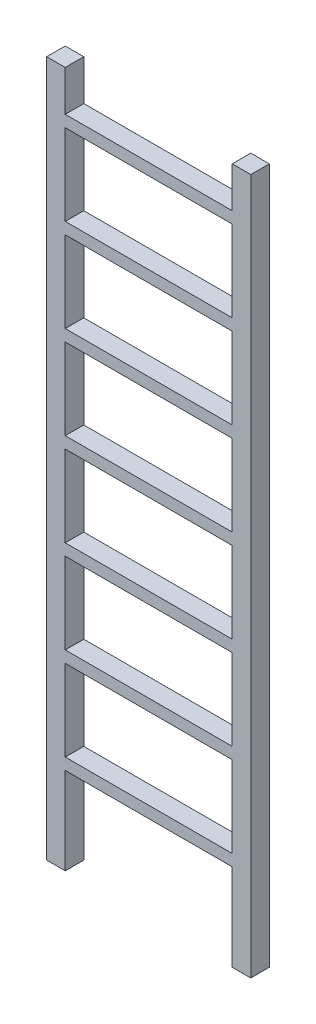
ISO-10303-21;
HEADER;
FILE_DESCRIPTION(('STEP AP214'),'2;1');
FILE_NAME('part.step','',(''),(''),'','','');
FILE_SCHEMA(('AUTOMOTIVE_DESIGN { 1 0 10303 214 1 1 1 1 }'));
ENDSEC;
DATA;
#1=APPLICATION_CONTEXT('core data for automotive mechanical design processes');
#2=APPLICATION_PROTOCOL_DEFINITION('international standard','automotive_design',2000,#1);
#3=PRODUCT_CONTEXT('',#1,'mechanical');
#4=PRODUCT('Part','Part','',(#3));
#5=PRODUCT_RELATED_PRODUCT_CATEGORY('part','',(#4));
#6=PRODUCT_DEFINITION_FORMATION('','',#4);
#7=PRODUCT_DEFINITION_CONTEXT('part definition',#1,'design');
#8=PRODUCT_DEFINITION('design','',#6,#7);
#9=PRODUCT_DEFINITION_SHAPE('','',#8);
#10=(LENGTH_UNIT() NAMED_UNIT(*) SI_UNIT(.MILLI.,.METRE.));
#11=(NAMED_UNIT(*) PLANE_ANGLE_UNIT() SI_UNIT($,.RADIAN.));
#12=(NAMED_UNIT(*) SI_UNIT($,.STERADIAN.) SOLID_ANGLE_UNIT());
#13=UNCERTAINTY_MEASURE_WITH_UNIT(LENGTH_MEASURE(1.E-05),#10,'distance_accuracy_value','');
#14=(GEOMETRIC_REPRESENTATION_CONTEXT(3) GLOBAL_UNCERTAINTY_ASSIGNED_CONTEXT((#13)) GLOBAL_UNIT_ASSIGNED_CONTEXT((#10,
#11,#12)) REPRESENTATION_CONTEXT('',''));
#15=CARTESIAN_POINT('',(0.,0.,0.));
#16=DIRECTION('',(0.,0.,1.));
#17=DIRECTION('',(1.,0.,0.));
#18=AXIS2_PLACEMENT_3D('',#15,#16,#17);
#19=CARTESIAN_POINT('',(-360.,-1500.,80.));
#20=DIRECTION('',(-1.,0.,0.));
#21=DIRECTION('',(0.,0.,1.));
#22=AXIS2_PLACEMENT_3D('',#19,#20,#21);
#23=PLANE('',#22);
#24=DIRECTION('',(0.,0.,1.));
#25=VECTOR('',#24,1.);
#26=CARTESIAN_POINT('',(-360.,-1075.,80.));
#27=LINE('',#26,#25);
#28=CARTESIAN_POINT('',(-360.,-1075.,0.));
#29=VERTEX_POINT('',#28);
#30=CARTESIAN_POINT('',(-360.,-1075.,80.));
#31=VERTEX_POINT('',#30);
#32=EDGE_CURVE('E309',#29,#31,#27,.T.);
#33=ORIENTED_EDGE('',*,*,#32,.F.);
#34=DIRECTION('',(0.,1.,0.));
#35=VECTOR('',#34,1.);
#36=CARTESIAN_POINT('',(-360.,-1500.,0.));
#37=LINE('',#36,#35);
#38=CARTESIAN_POINT('',(-360.,-725.,0.));
#39=VERTEX_POINT('',#38);
#40=EDGE_CURVE('E489',#29,#39,#37,.T.);
#41=ORIENTED_EDGE('',*,*,#40,.T.);
#42=DIRECTION('',(0.,0.,-1.));
#43=VECTOR('',#42,1.);
#44=CARTESIAN_POINT('',(-360.,-725.,80.));
#45=LINE('',#44,#43);
#46=CARTESIAN_POINT('',(-360.,-725.,80.));
#47=VERTEX_POINT('',#46);
#48=EDGE_CURVE('E327',#47,#39,#45,.T.);
#49=ORIENTED_EDGE('',*,*,#48,.F.);
#50=DIRECTION('',(0.,1.,0.));
#51=VECTOR('',#50,1.);
#52=CARTESIAN_POINT('',(-360.,-1500.,80.));
#53=LINE('',#52,#51);
#54=EDGE_CURVE('E478',#31,#47,#53,.T.);
#55=ORIENTED_EDGE('',*,*,#54,.F.);
#56=EDGE_LOOP('',(#33,#41,#49,#55));
#57=FACE_BOUND('',#56,.T.);
#58=ADVANCED_FACE('F41',(#57),#23,.F.);
#59=DIRECTION('',(0.,0.,-1.));
#60=VECTOR('',#59,1.);
#61=CARTESIAN_POINT('',(-360.,-1125.,80.));
#62=LINE('',#61,#60);
#63=CARTESIAN_POINT('',(-360.,-1125.,80.));
#64=VERTEX_POINT('',#63);
#65=CARTESIAN_POINT('',(-360.,-1125.,0.));
#66=VERTEX_POINT('',#65);
#67=EDGE_CURVE('E293',#64,#66,#62,.T.);
#68=ORIENTED_EDGE('',*,*,#67,.F.);
#69=CARTESIAN_POINT('',(-360.,-1500.,80.));
#70=VERTEX_POINT('',#69);
#71=EDGE_CURVE('E474',#70,#64,#53,.T.);
#72=ORIENTED_EDGE('',*,*,#71,.F.);
#73=DIRECTION('',(0.,0.,-1.));
#74=VECTOR('',#73,1.);
#75=CARTESIAN_POINT('',(-360.,-1500.,80.));
#76=LINE('',#75,#74);
#77=CARTESIAN_POINT('',(-360.,-1500.,0.));
#78=VERTEX_POINT('',#77);
#79=EDGE_CURVE('E485',#70,#78,#76,.T.);
#80=ORIENTED_EDGE('',*,*,#79,.T.);
#81=EDGE_CURVE('E486',#78,#66,#37,.T.);
#82=ORIENTED_EDGE('',*,*,#81,.T.);
#83=EDGE_LOOP('',(#68,#72,#80,#82));
#84=FACE_BOUND('',#83,.T.);
#85=ADVANCED_FACE('F664',(#84),#23,.F.);
#86=CARTESIAN_POINT('',(360.,-1500.,80.));
#87=DIRECTION('',(1.,0.,0.));
#88=DIRECTION('',(0.,0.,-1.));
#89=AXIS2_PLACEMENT_3D('',#86,#87,#88);
#90=PLANE('',#89);
#91=DIRECTION('',(0.,0.,-1.));
#92=VECTOR('',#91,1.);
#93=CARTESIAN_POINT('',(360.,-1075.,80.));
#94=LINE('',#93,#92);
#95=CARTESIAN_POINT('',(360.,-1075.,80.));
#96=VERTEX_POINT('',#95);
#97=CARTESIAN_POINT('',(360.,-1075.,0.));
#98=VERTEX_POINT('',#97);
#99=EDGE_CURVE('E64',#96,#98,#94,.T.);
#100=ORIENTED_EDGE('',*,*,#99,.F.);
#101=DIRECTION('',(0.,-1.,0.));
#102=VECTOR('',#101,1.);
#103=CARTESIAN_POINT('',(360.,-1500.,80.));
#104=LINE('',#103,#102);
#105=CARTESIAN_POINT('',(360.,-725.,80.));
#106=VERTEX_POINT('',#105);
#107=EDGE_CURVE('E556',#106,#96,#104,.T.);
#108=ORIENTED_EDGE('',*,*,#107,.F.);
#109=DIRECTION('',(0.,0.,1.));
#110=VECTOR('',#109,1.);
#111=CARTESIAN_POINT('',(360.,-725.,80.));
#112=LINE('',#111,#110);
#113=CARTESIAN_POINT('',(360.,-725.,0.));
#114=VERTEX_POINT('',#113);
#115=EDGE_CURVE('E320',#114,#106,#112,.T.);
#116=ORIENTED_EDGE('',*,*,#115,.F.);
#117=DIRECTION('',(0.,-1.,0.));
#118=VECTOR('',#117,1.);
#119=CARTESIAN_POINT('',(360.,-1500.,0.));
#120=LINE('',#119,#118);
#121=EDGE_CURVE('E284',#114,#98,#120,.T.);
#122=ORIENTED_EDGE('',*,*,#121,.T.);
#123=EDGE_LOOP('',(#100,#108,#116,#122));
#124=FACE_BOUND('',#123,.T.);
#125=ADVANCED_FACE('F543',(#124),#90,.F.);
#126=DIRECTION('',(0.,0.,1.));
#127=VECTOR('',#126,1.);
#128=CARTESIAN_POINT('',(360.,-1125.,80.));
#129=LINE('',#128,#127);
#130=CARTESIAN_POINT('',(360.,-1125.,0.));
#131=VERTEX_POINT('',#130);
#132=CARTESIAN_POINT('',(360.,-1125.,80.));
#133=VERTEX_POINT('',#132);
#134=EDGE_CURVE('E288',#131,#133,#129,.T.);
#135=ORIENTED_EDGE('',*,*,#134,.F.);
#136=CARTESIAN_POINT('',(360.,-1500.,0.));
#137=VERTEX_POINT('',#136);
#138=EDGE_CURVE('E275',#131,#137,#120,.T.);
#139=ORIENTED_EDGE('',*,*,#138,.T.);
#140=DIRECTION('',(0.,0.,-1.));
#141=VECTOR('',#140,1.);
#142=CARTESIAN_POINT('',(360.,-1500.,80.));
#143=LINE('',#142,#141);
#144=CARTESIAN_POINT('',(360.,-1500.,80.));
#145=VERTEX_POINT('',#144);
#146=EDGE_CURVE('E447',#145,#137,#143,.T.);
#147=ORIENTED_EDGE('',*,*,#146,.F.);
#148=EDGE_CURVE('E56',#133,#145,#104,.T.);
#149=ORIENTED_EDGE('',*,*,#148,.F.);
#150=EDGE_LOOP('',(#135,#139,#147,#149));
#151=FACE_BOUND('',#150,.T.);
#152=ADVANCED_FACE('F289',(#151),#90,.F.);
#153=DIRECTION('',(0.,0.,1.));
#154=VECTOR('',#153,1.);
#155=CARTESIAN_POINT('',(-360.,-675.,80.));
#156=LINE('',#155,#154);
#157=CARTESIAN_POINT('',(-360.,-675.,0.));
#158=VERTEX_POINT('',#157);
#159=CARTESIAN_POINT('',(-360.,-675.,80.));
#160=VERTEX_POINT('',#159);
#161=EDGE_CURVE('E333',#158,#160,#156,.T.);
#162=ORIENTED_EDGE('',*,*,#161,.F.);
#163=CARTESIAN_POINT('',(-360.,-325.,0.));
#164=VERTEX_POINT('',#163);
#165=EDGE_CURVE('E553',#158,#164,#37,.T.);
#166=ORIENTED_EDGE('',*,*,#165,.T.);
#167=DIRECTION('',(0.,0.,-1.));
#168=VECTOR('',#167,1.);
#169=CARTESIAN_POINT('',(-360.,-325.,80.));
#170=LINE('',#169,#168);
#171=CARTESIAN_POINT('',(-360.,-325.,80.));
#172=VERTEX_POINT('',#171);
#173=EDGE_CURVE('E351',#172,#164,#170,.T.);
#174=ORIENTED_EDGE('',*,*,#173,.F.);
#175=EDGE_CURVE('E623',#160,#172,#53,.T.);
#176=ORIENTED_EDGE('',*,*,#175,.F.);
#177=EDGE_LOOP('',(#162,#166,#174,#176));
#178=FACE_BOUND('',#177,.T.);
#179=ADVANCED_FACE('F641',(#178),#23,.F.);
#180=DIRECTION('',(0.,0.,-1.));
#181=VECTOR('',#180,1.);
#182=CARTESIAN_POINT('',(360.,-675.,80.));
#183=LINE('',#182,#181);
#184=CARTESIAN_POINT('',(360.,-675.,80.));
#185=VERTEX_POINT('',#184);
#186=CARTESIAN_POINT('',(360.,-675.,0.));
#187=VERTEX_POINT('',#186);
#188=EDGE_CURVE('E330',#185,#187,#183,.T.);
#189=ORIENTED_EDGE('',*,*,#188,.F.);
#190=CARTESIAN_POINT('',(360.,-325.,80.));
#191=VERTEX_POINT('',#190);
#192=EDGE_CURVE('E558',#191,#185,#104,.T.);
#193=ORIENTED_EDGE('',*,*,#192,.F.);
#194=DIRECTION('',(0.,0.,1.));
#195=VECTOR('',#194,1.);
#196=CARTESIAN_POINT('',(360.,-325.,80.));
#197=LINE('',#196,#195);
#198=CARTESIAN_POINT('',(360.,-325.,0.));
#199=VERTEX_POINT('',#198);
#200=EDGE_CURVE('E344',#199,#191,#197,.T.);
#201=ORIENTED_EDGE('',*,*,#200,.F.);
#202=EDGE_CURVE('E537',#199,#187,#120,.T.);
#203=ORIENTED_EDGE('',*,*,#202,.T.);
#204=EDGE_LOOP('',(#189,#193,#201,#203));
#205=FACE_BOUND('',#204,.T.);
#206=ADVANCED_FACE('F648',(#205),#90,.F.);
#207=DIRECTION('',(0.,0.,1.));
#208=VECTOR('',#207,1.);
#209=CARTESIAN_POINT('',(-360.,-275.,80.));
#210=LINE('',#209,#208);
#211=CARTESIAN_POINT('',(-360.,-275.,0.));
#212=VERTEX_POINT('',#211);
#213=CARTESIAN_POINT('',(-360.,-275.,80.));
#214=VERTEX_POINT('',#213);
#215=EDGE_CURVE('E357',#212,#214,#210,.T.);
#216=ORIENTED_EDGE('',*,*,#215,.F.);
#217=CARTESIAN_POINT('',(-360.,75.,0.));
#218=VERTEX_POINT('',#217);
#219=EDGE_CURVE('E621',#212,#218,#37,.T.);
#220=ORIENTED_EDGE('',*,*,#219,.T.);
#221=DIRECTION('',(0.,0.,-1.));
#222=VECTOR('',#221,1.);
#223=CARTESIAN_POINT('',(-360.,75.,80.));
#224=LINE('',#223,#222);
#225=CARTESIAN_POINT('',(-360.,75.,80.));
#226=VERTEX_POINT('',#225);
#227=EDGE_CURVE('E375',#226,#218,#224,.T.);
#228=ORIENTED_EDGE('',*,*,#227,.F.);
#229=EDGE_CURVE('E622',#214,#226,#53,.T.);
#230=ORIENTED_EDGE('',*,*,#229,.F.);
#231=EDGE_LOOP('',(#216,#220,#228,#230));
#232=FACE_BOUND('',#231,.T.);
#233=ADVANCED_FACE('F619',(#232),#23,.F.);
#234=DIRECTION('',(0.,0.,-1.));
#235=VECTOR('',#234,1.);
#236=CARTESIAN_POINT('',(360.,-275.,80.));
#237=LINE('',#236,#235);
#238=CARTESIAN_POINT('',(360.,-275.,80.));
#239=VERTEX_POINT('',#238);
#240=CARTESIAN_POINT('',(360.,-275.,0.));
#241=VERTEX_POINT('',#240);
#242=EDGE_CURVE('E354',#239,#241,#237,.T.);
#243=ORIENTED_EDGE('',*,*,#242,.F.);
#244=CARTESIAN_POINT('',(360.,75.,80.));
#245=VERTEX_POINT('',#244);
#246=EDGE_CURVE('E560',#245,#239,#104,.T.);
#247=ORIENTED_EDGE('',*,*,#246,.F.);
#248=DIRECTION('',(0.,0.,1.));
#249=VECTOR('',#248,1.);
#250=CARTESIAN_POINT('',(360.,75.,80.));
#251=LINE('',#250,#249);
#252=CARTESIAN_POINT('',(360.,75.,0.));
#253=VERTEX_POINT('',#252);
#254=EDGE_CURVE('E368',#253,#245,#251,.T.);
#255=ORIENTED_EDGE('',*,*,#254,.F.);
#256=EDGE_CURVE('E534',#253,#241,#120,.T.);
#257=ORIENTED_EDGE('',*,*,#256,.T.);
#258=EDGE_LOOP('',(#243,#247,#255,#257));
#259=FACE_BOUND('',#258,.T.);
#260=ADVANCED_FACE('F692',(#259),#90,.F.);
#261=DIRECTION('',(0.,0.,1.));
#262=VECTOR('',#261,1.);
#263=CARTESIAN_POINT('',(-360.,125.,80.));
#264=LINE('',#263,#262);
#265=CARTESIAN_POINT('',(-360.,125.,0.));
#266=VERTEX_POINT('',#265);
#267=CARTESIAN_POINT('',(-360.,125.,80.));
#268=VERTEX_POINT('',#267);
#269=EDGE_CURVE('E381',#266,#268,#264,.T.);
#270=ORIENTED_EDGE('',*,*,#269,.F.);
#271=CARTESIAN_POINT('',(-360.,475.,0.));
#272=VERTEX_POINT('',#271);
#273=EDGE_CURVE('E629',#266,#272,#37,.T.);
#274=ORIENTED_EDGE('',*,*,#273,.T.);
#275=DIRECTION('',(0.,0.,-1.));
#276=VECTOR('',#275,1.);
#277=CARTESIAN_POINT('',(-360.,475.,80.));
#278=LINE('',#277,#276);
#279=CARTESIAN_POINT('',(-360.,475.,80.));
#280=VERTEX_POINT('',#279);
#281=EDGE_CURVE('E399',#280,#272,#278,.T.);
#282=ORIENTED_EDGE('',*,*,#281,.F.);
#283=EDGE_CURVE('E525',#268,#280,#53,.T.);
#284=ORIENTED_EDGE('',*,*,#283,.F.);
#285=EDGE_LOOP('',(#270,#274,#282,#284));
#286=FACE_BOUND('',#285,.T.);
#287=ADVANCED_FACE('F628',(#286),#23,.F.);
#288=DIRECTION('',(0.,0.,-1.));
#289=VECTOR('',#288,1.);
#290=CARTESIAN_POINT('',(360.,125.,80.));
#291=LINE('',#290,#289);
#292=CARTESIAN_POINT('',(360.,125.,80.));
#293=VERTEX_POINT('',#292);
#294=CARTESIAN_POINT('',(360.,125.,0.));
#295=VERTEX_POINT('',#294);
#296=EDGE_CURVE('E378',#293,#295,#291,.T.);
#297=ORIENTED_EDGE('',*,*,#296,.F.);
#298=CARTESIAN_POINT('',(360.,475.,80.));
#299=VERTEX_POINT('',#298);
#300=EDGE_CURVE('E606',#299,#293,#104,.T.);
#301=ORIENTED_EDGE('',*,*,#300,.F.);
#302=DIRECTION('',(0.,0.,1.));
#303=VECTOR('',#302,1.);
#304=CARTESIAN_POINT('',(360.,475.,80.));
#305=LINE('',#304,#303);
#306=CARTESIAN_POINT('',(360.,475.,0.));
#307=VERTEX_POINT('',#306);
#308=EDGE_CURVE('E392',#307,#299,#305,.T.);
#309=ORIENTED_EDGE('',*,*,#308,.F.);
#310=EDGE_CURVE('E533',#307,#295,#120,.T.);
#311=ORIENTED_EDGE('',*,*,#310,.T.);
#312=EDGE_LOOP('',(#297,#301,#309,#311));
#313=FACE_BOUND('',#312,.T.);
#314=ADVANCED_FACE('F633',(#313),#90,.F.);
#315=DIRECTION('',(0.,0.,1.));
#316=VECTOR('',#315,1.);
#317=CARTESIAN_POINT('',(-360.,525.,80.));
#318=LINE('',#317,#316);
#319=CARTESIAN_POINT('',(-360.,525.,0.));
#320=VERTEX_POINT('',#319);
#321=CARTESIAN_POINT('',(-360.,525.,80.));
#322=VERTEX_POINT('',#321);
#323=EDGE_CURVE('E405',#320,#322,#318,.T.);
#324=ORIENTED_EDGE('',*,*,#323,.F.);
#325=CARTESIAN_POINT('',(-360.,875.,0.));
#326=VERTEX_POINT('',#325);
#327=EDGE_CURVE('E528',#320,#326,#37,.T.);
#328=ORIENTED_EDGE('',*,*,#327,.T.);
#329=DIRECTION('',(0.,0.,-1.));
#330=VECTOR('',#329,1.);
#331=CARTESIAN_POINT('',(-360.,875.,80.));
#332=LINE('',#331,#330);
#333=CARTESIAN_POINT('',(-360.,875.,80.));
#334=VERTEX_POINT('',#333);
#335=EDGE_CURVE('E416',#334,#326,#332,.T.);
#336=ORIENTED_EDGE('',*,*,#335,.F.);
#337=EDGE_CURVE('E521',#322,#334,#53,.T.);
#338=ORIENTED_EDGE('',*,*,#337,.F.);
#339=EDGE_LOOP('',(#324,#328,#336,#338));
#340=FACE_BOUND('',#339,.T.);
#341=ADVANCED_FACE('F527',(#340),#23,.F.);
#342=DIRECTION('',(0.,0.,-1.));
#343=VECTOR('',#342,1.);
#344=CARTESIAN_POINT('',(360.,525.,80.));
#345=LINE('',#344,#343);
#346=CARTESIAN_POINT('',(360.,525.,80.));
#347=VERTEX_POINT('',#346);
#348=CARTESIAN_POINT('',(360.,525.,0.));
#349=VERTEX_POINT('',#348);
#350=EDGE_CURVE('E402',#347,#349,#345,.T.);
#351=ORIENTED_EDGE('',*,*,#350,.F.);
#352=CARTESIAN_POINT('',(360.,875.,80.));
#353=VERTEX_POINT('',#352);
#354=EDGE_CURVE('E519',#353,#347,#104,.T.);
#355=ORIENTED_EDGE('',*,*,#354,.F.);
#356=DIRECTION('',(0.,0.,1.));
#357=VECTOR('',#356,1.);
#358=CARTESIAN_POINT('',(360.,875.,80.));
#359=LINE('',#358,#357);
#360=CARTESIAN_POINT('',(360.,875.,0.));
#361=VERTEX_POINT('',#360);
#362=EDGE_CURVE('E49',#361,#353,#359,.T.);
#363=ORIENTED_EDGE('',*,*,#362,.F.);
#364=EDGE_CURVE('E532',#361,#349,#120,.T.);
#365=ORIENTED_EDGE('',*,*,#364,.T.);
#366=EDGE_LOOP('',(#351,#355,#363,#365));
#367=FACE_BOUND('',#366,.T.);
#368=ADVANCED_FACE('F680',(#367),#90,.F.);
#369=DIRECTION('',(0.,0.,1.));
#370=VECTOR('',#369,1.);
#371=CARTESIAN_POINT('',(-360.,925.,80.));
#372=LINE('',#371,#370);
#373=CARTESIAN_POINT('',(-360.,925.,0.));
#374=VERTEX_POINT('',#373);
#375=CARTESIAN_POINT('',(-360.,925.,80.));
#376=VERTEX_POINT('',#375);
#377=EDGE_CURVE('E423',#374,#376,#372,.T.);
#378=ORIENTED_EDGE('',*,*,#377,.F.);
#379=CARTESIAN_POINT('',(-360.,1275.,0.));
#380=VERTEX_POINT('',#379);
#381=EDGE_CURVE('E586',#374,#380,#37,.T.);
#382=ORIENTED_EDGE('',*,*,#381,.T.);
#383=DIRECTION('',(0.,0.,-1.));
#384=VECTOR('',#383,1.);
#385=CARTESIAN_POINT('',(-360.,1275.,80.));
#386=LINE('',#385,#384);
#387=CARTESIAN_POINT('',(-360.,1275.,80.));
#388=VERTEX_POINT('',#387);
#389=EDGE_CURVE('E465',#388,#380,#386,.T.);
#390=ORIENTED_EDGE('',*,*,#389,.F.);
#391=EDGE_CURVE('E526',#376,#388,#53,.T.);
#392=ORIENTED_EDGE('',*,*,#391,.F.);
#393=EDGE_LOOP('',(#378,#382,#390,#392));
#394=FACE_BOUND('',#393,.T.);
#395=ADVANCED_FACE('F596',(#394),#23,.F.);
#396=DIRECTION('',(0.,0.,-1.));
#397=VECTOR('',#396,1.);
#398=CARTESIAN_POINT('',(360.,925.,80.));
#399=LINE('',#398,#397);
#400=CARTESIAN_POINT('',(360.,925.,80.));
#401=VERTEX_POINT('',#400);
#402=CARTESIAN_POINT('',(360.,925.,0.));
#403=VERTEX_POINT('',#402);
#404=EDGE_CURVE('E11',#401,#403,#399,.T.);
#405=ORIENTED_EDGE('',*,*,#404,.F.);
#406=CARTESIAN_POINT('',(360.,1275.,80.));
#407=VERTEX_POINT('',#406);
#408=EDGE_CURVE('E436',#407,#401,#104,.T.);
#409=ORIENTED_EDGE('',*,*,#408,.F.);
#410=DIRECTION('',(0.,0.,-1.));
#411=VECTOR('',#410,1.);
#412=CARTESIAN_POINT('',(360.,1275.,80.));
#413=LINE('',#412,#411);
#414=CARTESIAN_POINT('',(360.,1275.,0.));
#415=VERTEX_POINT('',#414);
#416=EDGE_CURVE('E506',#407,#415,#413,.T.);
#417=ORIENTED_EDGE('',*,*,#416,.T.);
#418=EDGE_CURVE('E443',#415,#403,#120,.T.);
#419=ORIENTED_EDGE('',*,*,#418,.T.);
#420=EDGE_LOOP('',(#405,#409,#417,#419));
#421=FACE_BOUND('',#420,.T.);
#422=ADVANCED_FACE('F602',(#421),#90,.F.);
#423=CARTESIAN_POINT('',(-400.,1325.,80.));
#424=DIRECTION('',(0.,-1.,0.));
#425=DIRECTION('',(0.,0.,-1.));
#426=AXIS2_PLACEMENT_3D('',#423,#424,#425);
#427=PLANE('',#426);
#428=DIRECTION('',(0.,0.,1.));
#429=VECTOR('',#428,1.);
#430=CARTESIAN_POINT('',(360.,1325.,80.));
#431=LINE('',#430,#429);
#432=CARTESIAN_POINT('',(360.,1325.,0.));
#433=VERTEX_POINT('',#432);
#434=CARTESIAN_POINT('',(360.,1325.,80.));
#435=VERTEX_POINT('',#434);
#436=EDGE_CURVE('E455',#433,#435,#431,.T.);
#437=ORIENTED_EDGE('',*,*,#436,.F.);
#438=DIRECTION('',(-1.,0.,0.));
#439=VECTOR('',#438,1.);
#440=CARTESIAN_POINT('',(-400.,1325.,0.));
#441=LINE('',#440,#439);
#442=CARTESIAN_POINT('',(-360.,1325.,0.));
#443=VERTEX_POINT('',#442);
#444=EDGE_CURVE('E458',#433,#443,#441,.T.);
#445=ORIENTED_EDGE('',*,*,#444,.T.);
#446=DIRECTION('',(0.,0.,1.));
#447=VECTOR('',#446,1.);
#448=CARTESIAN_POINT('',(-360.,1325.,80.));
#449=LINE('',#448,#447);
#450=CARTESIAN_POINT('',(-360.,1325.,80.));
#451=VERTEX_POINT('',#450);
#452=EDGE_CURVE('E470',#443,#451,#449,.T.);
#453=ORIENTED_EDGE('',*,*,#452,.T.);
#454=DIRECTION('',(-1.,0.,0.));
#455=VECTOR('',#454,1.);
#456=CARTESIAN_POINT('',(-400.,1325.,80.));
#457=LINE('',#456,#455);
#458=EDGE_CURVE('E459',#435,#451,#457,.T.);
#459=ORIENTED_EDGE('',*,*,#458,.F.);
#460=EDGE_LOOP('',(#437,#445,#453,#459));
#461=FACE_BOUND('',#460,.T.);
#462=ADVANCED_FACE('F579',(#461),#427,.F.);
#463=CARTESIAN_POINT('',(-400.,1275.,80.));
#464=DIRECTION('',(0.,1.,0.));
#465=DIRECTION('',(0.,0.,1.));
#466=AXIS2_PLACEMENT_3D('',#463,#464,#465);
#467=PLANE('',#466);
#468=ORIENTED_EDGE('',*,*,#416,.F.);
#469=DIRECTION('',(1.,0.,0.));
#470=VECTOR('',#469,1.);
#471=CARTESIAN_POINT('',(-400.,1275.,80.));
#472=LINE('',#471,#470);
#473=EDGE_CURVE('E461',#388,#407,#472,.T.);
#474=ORIENTED_EDGE('',*,*,#473,.F.);
#475=ORIENTED_EDGE('',*,*,#389,.T.);
#476=DIRECTION('',(1.,0.,0.));
#477=VECTOR('',#476,1.);
#478=CARTESIAN_POINT('',(-400.,1275.,0.));
#479=LINE('',#478,#477);
#480=EDGE_CURVE('E462',#380,#415,#479,.T.);
#481=ORIENTED_EDGE('',*,*,#480,.T.);
#482=EDGE_LOOP('',(#468,#474,#475,#481));
#483=FACE_BOUND('',#482,.T.);
#484=ADVANCED_FACE('F599',(#483),#467,.F.);
#485=ORIENTED_EDGE('',*,*,#452,.F.);
#486=CARTESIAN_POINT('',(-360.,1500.,0.));
#487=VERTEX_POINT('',#486);
#488=EDGE_CURVE('E473',#443,#487,#37,.T.);
#489=ORIENTED_EDGE('',*,*,#488,.T.);
#490=DIRECTION('',(0.,0.,-1.));
#491=VECTOR('',#490,1.);
#492=CARTESIAN_POINT('',(-360.,1500.,80.));
#493=LINE('',#492,#491);
#494=CARTESIAN_POINT('',(-360.,1500.,80.));
#495=VERTEX_POINT('',#494);
#496=EDGE_CURVE('E503',#495,#487,#493,.T.);
#497=ORIENTED_EDGE('',*,*,#496,.F.);
#498=EDGE_CURVE('E479',#451,#495,#53,.T.);
#499=ORIENTED_EDGE('',*,*,#498,.F.);
#500=EDGE_LOOP('',(#485,#489,#497,#499));
#501=FACE_BOUND('',#500,.T.);
#502=ADVANCED_FACE('F43',(#501),#23,.F.);
#503=CARTESIAN_POINT('',(-440.,1500.,80.));
#504=DIRECTION('',(0.,-1.,0.));
#505=DIRECTION('',(0.,0.,-1.));
#506=AXIS2_PLACEMENT_3D('',#503,#504,#505);
#507=PLANE('',#506);
#508=DIRECTION('',(-1.,0.,0.));
#509=VECTOR('',#508,1.);
#510=CARTESIAN_POINT('',(-440.,1500.,0.));
#511=LINE('',#510,#509);
#512=CARTESIAN_POINT('',(-440.,1500.,0.));
#513=VERTEX_POINT('',#512);
#514=EDGE_CURVE('E488',#487,#513,#511,.T.);
#515=ORIENTED_EDGE('',*,*,#514,.T.);
#516=DIRECTION('',(0.,0.,-1.));
#517=VECTOR('',#516,1.);
#518=CARTESIAN_POINT('',(-440.,1500.,80.));
#519=LINE('',#518,#517);
#520=CARTESIAN_POINT('',(-440.,1500.,80.));
#521=VERTEX_POINT('',#520);
#522=EDGE_CURVE('E500',#521,#513,#519,.T.);
#523=ORIENTED_EDGE('',*,*,#522,.F.);
#524=DIRECTION('',(-1.,0.,0.));
#525=VECTOR('',#524,1.);
#526=CARTESIAN_POINT('',(-440.,1500.,80.));
#527=LINE('',#526,#525);
#528=EDGE_CURVE('E477',#495,#521,#527,.T.);
#529=ORIENTED_EDGE('',*,*,#528,.F.);
#530=ORIENTED_EDGE('',*,*,#496,.T.);
#531=EDGE_LOOP('',(#515,#523,#529,#530));
#532=FACE_BOUND('',#531,.T.);
#533=ADVANCED_FACE('F670',(#532),#507,.F.);
#534=CARTESIAN_POINT('',(-440.,-1500.,80.));
#535=DIRECTION('',(1.,0.,0.));
#536=DIRECTION('',(0.,0.,-1.));
#537=AXIS2_PLACEMENT_3D('',#534,#535,#536);
#538=PLANE('',#537);
#539=DIRECTION('',(0.,-1.,0.));
#540=VECTOR('',#539,1.);
#541=CARTESIAN_POINT('',(-440.,-1500.,0.));
#542=LINE('',#541,#540);
#543=CARTESIAN_POINT('',(-440.,-1500.,0.));
#544=VERTEX_POINT('',#543);
#545=EDGE_CURVE('E491',#513,#544,#542,.T.);
#546=ORIENTED_EDGE('',*,*,#545,.T.);
#547=DIRECTION('',(0.,0.,-1.));
#548=VECTOR('',#547,1.);
#549=CARTESIAN_POINT('',(-440.,-1500.,80.));
#550=LINE('',#549,#548);
#551=CARTESIAN_POINT('',(-440.,-1500.,80.));
#552=VERTEX_POINT('',#551);
#553=EDGE_CURVE('E497',#552,#544,#550,.T.);
#554=ORIENTED_EDGE('',*,*,#553,.F.);
#555=DIRECTION('',(0.,-1.,0.));
#556=VECTOR('',#555,1.);
#557=CARTESIAN_POINT('',(-440.,-1500.,80.));
#558=LINE('',#557,#556);
#559=EDGE_CURVE('E481',#521,#552,#558,.T.);
#560=ORIENTED_EDGE('',*,*,#559,.F.);
#561=ORIENTED_EDGE('',*,*,#522,.T.);
#562=EDGE_LOOP('',(#546,#554,#560,#561));
#563=FACE_BOUND('',#562,.T.);
#564=ADVANCED_FACE('F676',(#563),#538,.F.);
#565=CARTESIAN_POINT('',(-440.,-1500.,80.));
#566=DIRECTION('',(0.,1.,0.));
#567=DIRECTION('',(0.,0.,1.));
#568=AXIS2_PLACEMENT_3D('',#565,#566,#567);
#569=PLANE('',#568);
#570=DIRECTION('',(1.,0.,0.));
#571=VECTOR('',#570,1.);
#572=CARTESIAN_POINT('',(-440.,-1500.,0.));
#573=LINE('',#572,#571);
#574=EDGE_CURVE('E493',#544,#78,#573,.T.);
#575=ORIENTED_EDGE('',*,*,#574,.T.);
#576=ORIENTED_EDGE('',*,*,#79,.F.);
#577=DIRECTION('',(1.,0.,0.));
#578=VECTOR('',#577,1.);
#579=CARTESIAN_POINT('',(-440.,-1500.,80.));
#580=LINE('',#579,#578);
#581=EDGE_CURVE('E483',#552,#70,#580,.T.);
#582=ORIENTED_EDGE('',*,*,#581,.F.);
#583=ORIENTED_EDGE('',*,*,#553,.T.);
#584=EDGE_LOOP('',(#575,#576,#582,#583));
#585=FACE_BOUND('',#584,.T.);
#586=ADVANCED_FACE('F720',(#585),#569,.F.);
#587=CARTESIAN_POINT('',(0.,0.,80.));
#588=DIRECTION('',(0.,0.,-1.));
#589=DIRECTION('',(-1.,0.,0.));
#590=AXIS2_PLACEMENT_3D('',#587,#588,#589);
#591=PLANE('',#590);
#592=DIRECTION('',(-1.,0.,0.));
#593=VECTOR('',#592,1.);
#594=CARTESIAN_POINT('',(-400.,-1075.,80.));
#595=LINE('',#594,#593);
#596=EDGE_CURVE('E298',#96,#31,#595,.T.);
#597=ORIENTED_EDGE('',*,*,#596,.T.);
#598=ORIENTED_EDGE('',*,*,#54,.T.);
#599=DIRECTION('',(1.,0.,0.));
#600=VECTOR('',#599,1.);
#601=CARTESIAN_POINT('',(-400.,-725.,80.));
#602=LINE('',#601,#600);
#603=EDGE_CURVE('E316',#47,#106,#602,.T.);
#604=ORIENTED_EDGE('',*,*,#603,.T.);
#605=ORIENTED_EDGE('',*,*,#107,.T.);
#606=EDGE_LOOP('',(#597,#598,#604,#605));
#607=FACE_BOUND('',#606,.T.);
#608=ORIENTED_EDGE('',*,*,#71,.T.);
#609=DIRECTION('',(1.,0.,0.));
#610=VECTOR('',#609,1.);
#611=CARTESIAN_POINT('',(-400.,-1125.,80.));
#612=LINE('',#611,#610);
#613=EDGE_CURVE('E294',#64,#133,#612,.T.);
#614=ORIENTED_EDGE('',*,*,#613,.T.);
#615=ORIENTED_EDGE('',*,*,#148,.T.);
#616=DIRECTION('',(1.,0.,0.));
#617=VECTOR('',#616,1.);
#618=CARTESIAN_POINT('',(360.,-1500.,80.));
#619=LINE('',#618,#617);
#620=CARTESIAN_POINT('',(440.,-1500.,80.));
#621=VERTEX_POINT('',#620);
#622=EDGE_CURVE('E435',#145,#621,#619,.T.);
#623=ORIENTED_EDGE('',*,*,#622,.T.);
#624=DIRECTION('',(0.,1.,0.));
#625=VECTOR('',#624,1.);
#626=CARTESIAN_POINT('',(440.,-1500.,80.));
#627=LINE('',#626,#625);
#628=CARTESIAN_POINT('',(440.,1500.,80.));
#629=VERTEX_POINT('',#628);
#630=EDGE_CURVE('E427',#621,#629,#627,.T.);
#631=ORIENTED_EDGE('',*,*,#630,.T.);
#632=DIRECTION('',(-1.,0.,0.));
#633=VECTOR('',#632,1.);
#634=CARTESIAN_POINT('',(360.,1500.,80.));
#635=LINE('',#634,#633);
#636=CARTESIAN_POINT('',(360.,1500.,80.));
#637=VERTEX_POINT('',#636);
#638=EDGE_CURVE('E430',#629,#637,#635,.T.);
#639=ORIENTED_EDGE('',*,*,#638,.T.);
#640=EDGE_CURVE('E432',#637,#435,#104,.T.);
#641=ORIENTED_EDGE('',*,*,#640,.T.);
#642=ORIENTED_EDGE('',*,*,#458,.T.);
#643=ORIENTED_EDGE('',*,*,#498,.T.);
#644=ORIENTED_EDGE('',*,*,#528,.T.);
#645=ORIENTED_EDGE('',*,*,#559,.T.);
#646=ORIENTED_EDGE('',*,*,#581,.T.);
#647=EDGE_LOOP('',(#608,#614,#615,#623,#631,#639,#641,#642,#643,#644,#645,#646));
#648=FACE_BOUND('',#647,.T.);
#649=DIRECTION('',(-1.,0.,0.));
#650=VECTOR('',#649,1.);
#651=CARTESIAN_POINT('',(-400.,-675.,80.));
#652=LINE('',#651,#650);
#653=EDGE_CURVE('E313',#185,#160,#652,.T.);
#654=ORIENTED_EDGE('',*,*,#653,.T.);
#655=ORIENTED_EDGE('',*,*,#175,.T.);
#656=DIRECTION('',(1.,0.,0.));
#657=VECTOR('',#656,1.);
#658=CARTESIAN_POINT('',(-400.,-325.,80.));
#659=LINE('',#658,#657);
#660=EDGE_CURVE('E340',#172,#191,#659,.T.);
#661=ORIENTED_EDGE('',*,*,#660,.T.);
#662=ORIENTED_EDGE('',*,*,#192,.T.);
#663=EDGE_LOOP('',(#654,#655,#661,#662));
#664=FACE_BOUND('',#663,.T.);
#665=DIRECTION('',(-1.,0.,0.));
#666=VECTOR('',#665,1.);
#667=CARTESIAN_POINT('',(-400.,-275.,80.));
#668=LINE('',#667,#666);
#669=EDGE_CURVE('E337',#239,#214,#668,.T.);
#670=ORIENTED_EDGE('',*,*,#669,.T.);
#671=ORIENTED_EDGE('',*,*,#229,.T.);
#672=DIRECTION('',(1.,0.,0.));
#673=VECTOR('',#672,1.);
#674=CARTESIAN_POINT('',(-400.,75.,80.));
#675=LINE('',#674,#673);
#676=EDGE_CURVE('E364',#226,#245,#675,.T.);
#677=ORIENTED_EDGE('',*,*,#676,.T.);
#678=ORIENTED_EDGE('',*,*,#246,.T.);
#679=EDGE_LOOP('',(#670,#671,#677,#678));
#680=FACE_BOUND('',#679,.T.);
#681=DIRECTION('',(-1.,0.,0.));
#682=VECTOR('',#681,1.);
#683=CARTESIAN_POINT('',(-400.,125.,80.));
#684=LINE('',#683,#682);
#685=EDGE_CURVE('E361',#293,#268,#684,.T.);
#686=ORIENTED_EDGE('',*,*,#685,.T.);
#687=ORIENTED_EDGE('',*,*,#283,.T.);
#688=DIRECTION('',(1.,0.,0.));
#689=VECTOR('',#688,1.);
#690=CARTESIAN_POINT('',(-400.,475.,80.));
#691=LINE('',#690,#689);
#692=EDGE_CURVE('E388',#280,#299,#691,.T.);
#693=ORIENTED_EDGE('',*,*,#692,.T.);
#694=ORIENTED_EDGE('',*,*,#300,.T.);
#695=EDGE_LOOP('',(#686,#687,#693,#694));
#696=FACE_BOUND('',#695,.T.);
#697=DIRECTION('',(-1.,0.,0.));
#698=VECTOR('',#697,1.);
#699=CARTESIAN_POINT('',(-400.,525.,80.));
#700=LINE('',#699,#698);
#701=EDGE_CURVE('E385',#347,#322,#700,.T.);
#702=ORIENTED_EDGE('',*,*,#701,.T.);
#703=ORIENTED_EDGE('',*,*,#337,.T.);
#704=DIRECTION('',(1.,0.,0.));
#705=VECTOR('',#704,1.);
#706=CARTESIAN_POINT('',(-400.,875.,80.));
#707=LINE('',#706,#705);
#708=EDGE_CURVE('E412',#334,#353,#707,.T.);
#709=ORIENTED_EDGE('',*,*,#708,.T.);
#710=ORIENTED_EDGE('',*,*,#354,.T.);
#711=EDGE_LOOP('',(#702,#703,#709,#710));
#712=FACE_BOUND('',#711,.T.);
#713=ORIENTED_EDGE('',*,*,#408,.T.);
#714=DIRECTION('',(-1.,0.,0.));
#715=VECTOR('',#714,1.);
#716=CARTESIAN_POINT('',(-400.,925.,80.));
#717=LINE('',#716,#715);
#718=EDGE_CURVE('E409',#401,#376,#717,.T.);
#719=ORIENTED_EDGE('',*,*,#718,.T.);
#720=ORIENTED_EDGE('',*,*,#391,.T.);
#721=ORIENTED_EDGE('',*,*,#473,.T.);
#722=EDGE_LOOP('',(#713,#719,#720,#721));
#723=FACE_BOUND('',#722,.T.);
#724=ADVANCED_FACE('F517',(#607,#648,#664,#680,#696,#712,#723),#591,.F.);
#725=CARTESIAN_POINT('',(0.,0.,0.));
#726=DIRECTION('',(0.,0.,-1.));
#727=DIRECTION('',(-1.,0.,0.));
#728=AXIS2_PLACEMENT_3D('',#725,#726,#727);
#729=PLANE('',#728);
#730=ORIENTED_EDGE('',*,*,#40,.F.);
#731=DIRECTION('',(-1.,0.,0.));
#732=VECTOR('',#731,1.);
#733=CARTESIAN_POINT('',(-400.,-1075.,0.));
#734=LINE('',#733,#732);
#735=EDGE_CURVE('E299',#98,#29,#734,.T.);
#736=ORIENTED_EDGE('',*,*,#735,.F.);
#737=ORIENTED_EDGE('',*,*,#121,.F.);
#738=DIRECTION('',(1.,0.,0.));
#739=VECTOR('',#738,1.);
#740=CARTESIAN_POINT('',(-400.,-725.,0.));
#741=LINE('',#740,#739);
#742=EDGE_CURVE('E317',#39,#114,#741,.T.);
#743=ORIENTED_EDGE('',*,*,#742,.F.);
#744=EDGE_LOOP('',(#730,#736,#737,#743));
#745=FACE_BOUND('',#744,.T.);
#746=ORIENTED_EDGE('',*,*,#138,.F.);
#747=DIRECTION('',(1.,0.,0.));
#748=VECTOR('',#747,1.);
#749=CARTESIAN_POINT('',(-400.,-1125.,0.));
#750=LINE('',#749,#748);
#751=EDGE_CURVE('E280',#66,#131,#750,.T.);
#752=ORIENTED_EDGE('',*,*,#751,.F.);
#753=ORIENTED_EDGE('',*,*,#81,.F.);
#754=ORIENTED_EDGE('',*,*,#574,.F.);
#755=ORIENTED_EDGE('',*,*,#545,.F.);
#756=ORIENTED_EDGE('',*,*,#514,.F.);
#757=ORIENTED_EDGE('',*,*,#488,.F.);
#758=ORIENTED_EDGE('',*,*,#444,.F.);
#759=CARTESIAN_POINT('',(360.,1500.,0.));
#760=VERTEX_POINT('',#759);
#761=EDGE_CURVE('E287',#760,#433,#120,.T.);
#762=ORIENTED_EDGE('',*,*,#761,.F.);
#763=DIRECTION('',(-1.,0.,0.));
#764=VECTOR('',#763,1.);
#765=CARTESIAN_POINT('',(360.,1500.,0.));
#766=LINE('',#765,#764);
#767=CARTESIAN_POINT('',(440.,1500.,0.));
#768=VERTEX_POINT('',#767);
#769=EDGE_CURVE('E285',#768,#760,#766,.T.);
#770=ORIENTED_EDGE('',*,*,#769,.F.);
#771=DIRECTION('',(0.,1.,0.));
#772=VECTOR('',#771,1.);
#773=CARTESIAN_POINT('',(440.,-1500.,0.));
#774=LINE('',#773,#772);
#775=CARTESIAN_POINT('',(440.,-1500.,0.));
#776=VERTEX_POINT('',#775);
#777=EDGE_CURVE('E426',#776,#768,#774,.T.);
#778=ORIENTED_EDGE('',*,*,#777,.F.);
#779=DIRECTION('',(1.,0.,0.));
#780=VECTOR('',#779,1.);
#781=CARTESIAN_POINT('',(360.,-1500.,0.));
#782=LINE('',#781,#780);
#783=EDGE_CURVE('E282',#137,#776,#782,.T.);
#784=ORIENTED_EDGE('',*,*,#783,.F.);
#785=EDGE_LOOP('',(#746,#752,#753,#754,#755,#756,#757,#758,#762,#770,#778,#784));
#786=FACE_BOUND('',#785,.T.);
#787=ORIENTED_EDGE('',*,*,#165,.F.);
#788=DIRECTION('',(-1.,0.,0.));
#789=VECTOR('',#788,1.);
#790=CARTESIAN_POINT('',(-400.,-675.,0.));
#791=LINE('',#790,#789);
#792=EDGE_CURVE('E312',#187,#158,#791,.T.);
#793=ORIENTED_EDGE('',*,*,#792,.F.);
#794=ORIENTED_EDGE('',*,*,#202,.F.);
#795=DIRECTION('',(1.,0.,0.));
#796=VECTOR('',#795,1.);
#797=CARTESIAN_POINT('',(-400.,-325.,0.));
#798=LINE('',#797,#796);
#799=EDGE_CURVE('E341',#164,#199,#798,.T.);
#800=ORIENTED_EDGE('',*,*,#799,.F.);
#801=EDGE_LOOP('',(#787,#793,#794,#800));
#802=FACE_BOUND('',#801,.T.);
#803=ORIENTED_EDGE('',*,*,#219,.F.);
#804=DIRECTION('',(-1.,0.,0.));
#805=VECTOR('',#804,1.);
#806=CARTESIAN_POINT('',(-400.,-275.,0.));
#807=LINE('',#806,#805);
#808=EDGE_CURVE('E336',#241,#212,#807,.T.);
#809=ORIENTED_EDGE('',*,*,#808,.F.);
#810=ORIENTED_EDGE('',*,*,#256,.F.);
#811=DIRECTION('',(1.,0.,0.));
#812=VECTOR('',#811,1.);
#813=CARTESIAN_POINT('',(-400.,75.,0.));
#814=LINE('',#813,#812);
#815=EDGE_CURVE('E365',#218,#253,#814,.T.);
#816=ORIENTED_EDGE('',*,*,#815,.F.);
#817=EDGE_LOOP('',(#803,#809,#810,#816));
#818=FACE_BOUND('',#817,.T.);
#819=ORIENTED_EDGE('',*,*,#273,.F.);
#820=DIRECTION('',(-1.,0.,0.));
#821=VECTOR('',#820,1.);
#822=CARTESIAN_POINT('',(-400.,125.,0.));
#823=LINE('',#822,#821);
#824=EDGE_CURVE('E360',#295,#266,#823,.T.);
#825=ORIENTED_EDGE('',*,*,#824,.F.);
#826=ORIENTED_EDGE('',*,*,#310,.F.);
#827=DIRECTION('',(1.,0.,0.));
#828=VECTOR('',#827,1.);
#829=CARTESIAN_POINT('',(-400.,475.,0.));
#830=LINE('',#829,#828);
#831=EDGE_CURVE('E389',#272,#307,#830,.T.);
#832=ORIENTED_EDGE('',*,*,#831,.F.);
#833=EDGE_LOOP('',(#819,#825,#826,#832));
#834=FACE_BOUND('',#833,.T.);
#835=ORIENTED_EDGE('',*,*,#327,.F.);
#836=DIRECTION('',(-1.,0.,0.));
#837=VECTOR('',#836,1.);
#838=CARTESIAN_POINT('',(-400.,525.,0.));
#839=LINE('',#838,#837);
#840=EDGE_CURVE('E384',#349,#320,#839,.T.);
#841=ORIENTED_EDGE('',*,*,#840,.F.);
#842=ORIENTED_EDGE('',*,*,#364,.F.);
#843=DIRECTION('',(1.,0.,0.));
#844=VECTOR('',#843,1.);
#845=CARTESIAN_POINT('',(-400.,875.,0.));
#846=LINE('',#845,#844);
#847=EDGE_CURVE('E413',#326,#361,#846,.T.);
#848=ORIENTED_EDGE('',*,*,#847,.F.);
#849=EDGE_LOOP('',(#835,#841,#842,#848));
#850=FACE_BOUND('',#849,.T.);
#851=DIRECTION('',(-1.,0.,0.));
#852=VECTOR('',#851,1.);
#853=CARTESIAN_POINT('',(-400.,925.,0.));
#854=LINE('',#853,#852);
#855=EDGE_CURVE('E408',#403,#374,#854,.T.);
#856=ORIENTED_EDGE('',*,*,#855,.F.);
#857=ORIENTED_EDGE('',*,*,#418,.F.);
#858=ORIENTED_EDGE('',*,*,#480,.F.);
#859=ORIENTED_EDGE('',*,*,#381,.F.);
#860=EDGE_LOOP('',(#856,#857,#858,#859));
#861=FACE_BOUND('',#860,.T.);
#862=ADVANCED_FACE('F276',(#745,#786,#802,#818,#834,#850,#861),#729,.T.);
#863=ORIENTED_EDGE('',*,*,#761,.T.);
#864=ORIENTED_EDGE('',*,*,#436,.T.);
#865=ORIENTED_EDGE('',*,*,#640,.F.);
#866=DIRECTION('',(0.,0.,-1.));
#867=VECTOR('',#866,1.);
#868=CARTESIAN_POINT('',(360.,1500.,80.));
#869=LINE('',#868,#867);
#870=EDGE_CURVE('E449',#637,#760,#869,.T.);
#871=ORIENTED_EDGE('',*,*,#870,.T.);
#872=EDGE_LOOP('',(#863,#864,#865,#871));
#873=FACE_BOUND('',#872,.T.);
#874=ADVANCED_FACE('F576',(#873),#90,.F.);
#875=CARTESIAN_POINT('',(440.,-1500.,80.));
#876=DIRECTION('',(-1.,0.,0.));
#877=DIRECTION('',(0.,0.,1.));
#878=AXIS2_PLACEMENT_3D('',#875,#876,#877);
#879=PLANE('',#878);
#880=ORIENTED_EDGE('',*,*,#777,.T.);
#881=DIRECTION('',(0.,0.,-1.));
#882=VECTOR('',#881,1.);
#883=CARTESIAN_POINT('',(440.,1500.,80.));
#884=LINE('',#883,#882);
#885=EDGE_CURVE('E452',#629,#768,#884,.T.);
#886=ORIENTED_EDGE('',*,*,#885,.F.);
#887=ORIENTED_EDGE('',*,*,#630,.F.);
#888=DIRECTION('',(0.,0.,-1.));
#889=VECTOR('',#888,1.);
#890=CARTESIAN_POINT('',(440.,-1500.,80.));
#891=LINE('',#890,#889);
#892=EDGE_CURVE('E438',#621,#776,#891,.T.);
#893=ORIENTED_EDGE('',*,*,#892,.T.);
#894=EDGE_LOOP('',(#880,#886,#887,#893));
#895=FACE_BOUND('',#894,.T.);
#896=ADVANCED_FACE('F569',(#895),#879,.F.);
#897=CARTESIAN_POINT('',(360.,1500.,80.));
#898=DIRECTION('',(0.,-1.,0.));
#899=DIRECTION('',(0.,0.,-1.));
#900=AXIS2_PLACEMENT_3D('',#897,#898,#899);
#901=PLANE('',#900);
#902=ORIENTED_EDGE('',*,*,#769,.T.);
#903=ORIENTED_EDGE('',*,*,#870,.F.);
#904=ORIENTED_EDGE('',*,*,#638,.F.);
#905=ORIENTED_EDGE('',*,*,#885,.T.);
#906=EDGE_LOOP('',(#902,#903,#904,#905));
#907=FACE_BOUND('',#906,.T.);
#908=ADVANCED_FACE('F573',(#907),#901,.F.);
#909=CARTESIAN_POINT('',(360.,-1500.,80.));
#910=DIRECTION('',(0.,1.,0.));
#911=DIRECTION('',(0.,0.,1.));
#912=AXIS2_PLACEMENT_3D('',#909,#910,#911);
#913=PLANE('',#912);
#914=ORIENTED_EDGE('',*,*,#783,.T.);
#915=ORIENTED_EDGE('',*,*,#892,.F.);
#916=ORIENTED_EDGE('',*,*,#622,.F.);
#917=ORIENTED_EDGE('',*,*,#146,.T.);
#918=EDGE_LOOP('',(#914,#915,#916,#917));
#919=FACE_BOUND('',#918,.T.);
#920=ADVANCED_FACE('F565',(#919),#913,.F.);
#921=CARTESIAN_POINT('',(-400.,925.,80.));
#922=DIRECTION('',(0.,-1.,0.));
#923=DIRECTION('',(0.,0.,-1.));
#924=AXIS2_PLACEMENT_3D('',#921,#922,#923);
#925=PLANE('',#924);
#926=ORIENTED_EDGE('',*,*,#855,.T.);
#927=ORIENTED_EDGE('',*,*,#377,.T.);
#928=ORIENTED_EDGE('',*,*,#718,.F.);
#929=ORIENTED_EDGE('',*,*,#404,.T.);
#930=EDGE_LOOP('',(#926,#927,#928,#929));
#931=FACE_BOUND('',#930,.T.);
#932=ADVANCED_FACE('F605',(#931),#925,.F.);
#933=CARTESIAN_POINT('',(-400.,875.,80.));
#934=DIRECTION('',(0.,1.,0.));
#935=DIRECTION('',(0.,0.,1.));
#936=AXIS2_PLACEMENT_3D('',#933,#934,#935);
#937=PLANE('',#936);
#938=ORIENTED_EDGE('',*,*,#708,.F.);
#939=ORIENTED_EDGE('',*,*,#335,.T.);
#940=ORIENTED_EDGE('',*,*,#847,.T.);
#941=ORIENTED_EDGE('',*,*,#362,.T.);
#942=EDGE_LOOP('',(#938,#939,#940,#941));
#943=FACE_BOUND('',#942,.T.);
#944=ADVANCED_FACE('F512',(#943),#937,.F.);
#945=CARTESIAN_POINT('',(-400.,525.,80.));
#946=DIRECTION('',(0.,-1.,0.));
#947=DIRECTION('',(0.,0.,-1.));
#948=AXIS2_PLACEMENT_3D('',#945,#946,#947);
#949=PLANE('',#948);
#950=ORIENTED_EDGE('',*,*,#840,.T.);
#951=ORIENTED_EDGE('',*,*,#323,.T.);
#952=ORIENTED_EDGE('',*,*,#701,.F.);
#953=ORIENTED_EDGE('',*,*,#350,.T.);
#954=EDGE_LOOP('',(#950,#951,#952,#953));
#955=FACE_BOUND('',#954,.T.);
#956=ADVANCED_FACE('F800',(#955),#949,.F.);
#957=CARTESIAN_POINT('',(-400.,475.,80.));
#958=DIRECTION('',(0.,1.,0.));
#959=DIRECTION('',(0.,0.,1.));
#960=AXIS2_PLACEMENT_3D('',#957,#958,#959);
#961=PLANE('',#960);
#962=ORIENTED_EDGE('',*,*,#692,.F.);
#963=ORIENTED_EDGE('',*,*,#281,.T.);
#964=ORIENTED_EDGE('',*,*,#831,.T.);
#965=ORIENTED_EDGE('',*,*,#308,.T.);
#966=EDGE_LOOP('',(#962,#963,#964,#965));
#967=FACE_BOUND('',#966,.T.);
#968=ADVANCED_FACE('F632',(#967),#961,.F.);
#969=CARTESIAN_POINT('',(-400.,125.,80.));
#970=DIRECTION('',(0.,-1.,0.));
#971=DIRECTION('',(0.,0.,-1.));
#972=AXIS2_PLACEMENT_3D('',#969,#970,#971);
#973=PLANE('',#972);
#974=ORIENTED_EDGE('',*,*,#824,.T.);
#975=ORIENTED_EDGE('',*,*,#269,.T.);
#976=ORIENTED_EDGE('',*,*,#685,.F.);
#977=ORIENTED_EDGE('',*,*,#296,.T.);
#978=EDGE_LOOP('',(#974,#975,#976,#977));
#979=FACE_BOUND('',#978,.T.);
#980=ADVANCED_FACE('F636',(#979),#973,.F.);
#981=CARTESIAN_POINT('',(-400.,75.,80.));
#982=DIRECTION('',(0.,1.,0.));
#983=DIRECTION('',(0.,0.,1.));
#984=AXIS2_PLACEMENT_3D('',#981,#982,#983);
#985=PLANE('',#984);
#986=ORIENTED_EDGE('',*,*,#676,.F.);
#987=ORIENTED_EDGE('',*,*,#227,.T.);
#988=ORIENTED_EDGE('',*,*,#815,.T.);
#989=ORIENTED_EDGE('',*,*,#254,.T.);
#990=EDGE_LOOP('',(#986,#987,#988,#989));
#991=FACE_BOUND('',#990,.T.);
#992=ADVANCED_FACE('F842',(#991),#985,.F.);
#993=CARTESIAN_POINT('',(-400.,-275.,80.));
#994=DIRECTION('',(0.,-1.,0.));
#995=DIRECTION('',(0.,0.,-1.));
#996=AXIS2_PLACEMENT_3D('',#993,#994,#995);
#997=PLANE('',#996);
#998=ORIENTED_EDGE('',*,*,#808,.T.);
#999=ORIENTED_EDGE('',*,*,#215,.T.);
#1000=ORIENTED_EDGE('',*,*,#669,.F.);
#1001=ORIENTED_EDGE('',*,*,#242,.T.);
#1002=EDGE_LOOP('',(#998,#999,#1000,#1001));
#1003=FACE_BOUND('',#1002,.T.);
#1004=ADVANCED_FACE('F615',(#1003),#997,.F.);
#1005=CARTESIAN_POINT('',(-400.,-325.,80.));
#1006=DIRECTION('',(0.,1.,0.));
#1007=DIRECTION('',(0.,0.,1.));
#1008=AXIS2_PLACEMENT_3D('',#1005,#1006,#1007);
#1009=PLANE('',#1008);
#1010=ORIENTED_EDGE('',*,*,#660,.F.);
#1011=ORIENTED_EDGE('',*,*,#173,.T.);
#1012=ORIENTED_EDGE('',*,*,#799,.T.);
#1013=ORIENTED_EDGE('',*,*,#200,.T.);
#1014=EDGE_LOOP('',(#1010,#1011,#1012,#1013));
#1015=FACE_BOUND('',#1014,.T.);
#1016=ADVANCED_FACE('F646',(#1015),#1009,.F.);
#1017=CARTESIAN_POINT('',(-400.,-675.,80.));
#1018=DIRECTION('',(0.,-1.,0.));
#1019=DIRECTION('',(0.,0.,-1.));
#1020=AXIS2_PLACEMENT_3D('',#1017,#1018,#1019);
#1021=PLANE('',#1020);
#1022=ORIENTED_EDGE('',*,*,#792,.T.);
#1023=ORIENTED_EDGE('',*,*,#161,.T.);
#1024=ORIENTED_EDGE('',*,*,#653,.F.);
#1025=ORIENTED_EDGE('',*,*,#188,.T.);
#1026=EDGE_LOOP('',(#1022,#1023,#1024,#1025));
#1027=FACE_BOUND('',#1026,.T.);
#1028=ADVANCED_FACE('F651',(#1027),#1021,.F.);
#1029=CARTESIAN_POINT('',(-400.,-725.,80.));
#1030=DIRECTION('',(0.,1.,0.));
#1031=DIRECTION('',(0.,0.,1.));
#1032=AXIS2_PLACEMENT_3D('',#1029,#1030,#1031);
#1033=PLANE('',#1032);
#1034=ORIENTED_EDGE('',*,*,#603,.F.);
#1035=ORIENTED_EDGE('',*,*,#48,.T.);
#1036=ORIENTED_EDGE('',*,*,#742,.T.);
#1037=ORIENTED_EDGE('',*,*,#115,.T.);
#1038=EDGE_LOOP('',(#1034,#1035,#1036,#1037));
#1039=FACE_BOUND('',#1038,.T.);
#1040=ADVANCED_FACE('F653',(#1039),#1033,.F.);
#1041=CARTESIAN_POINT('',(-400.,-1075.,80.));
#1042=DIRECTION('',(0.,-1.,0.));
#1043=DIRECTION('',(0.,0.,-1.));
#1044=AXIS2_PLACEMENT_3D('',#1041,#1042,#1043);
#1045=PLANE('',#1044);
#1046=ORIENTED_EDGE('',*,*,#735,.T.);
#1047=ORIENTED_EDGE('',*,*,#32,.T.);
#1048=ORIENTED_EDGE('',*,*,#596,.F.);
#1049=ORIENTED_EDGE('',*,*,#99,.T.);
#1050=EDGE_LOOP('',(#1046,#1047,#1048,#1049));
#1051=FACE_BOUND('',#1050,.T.);
#1052=ADVANCED_FACE('F549',(#1051),#1045,.F.);
#1053=CARTESIAN_POINT('',(-400.,-1125.,80.));
#1054=DIRECTION('',(0.,1.,0.));
#1055=DIRECTION('',(0.,0.,1.));
#1056=AXIS2_PLACEMENT_3D('',#1053,#1054,#1055);
#1057=PLANE('',#1056);
#1058=ORIENTED_EDGE('',*,*,#613,.F.);
#1059=ORIENTED_EDGE('',*,*,#67,.T.);
#1060=ORIENTED_EDGE('',*,*,#751,.T.);
#1061=ORIENTED_EDGE('',*,*,#134,.T.);
#1062=EDGE_LOOP('',(#1058,#1059,#1060,#1061));
#1063=FACE_BOUND('',#1062,.T.);
#1064=ADVANCED_FACE('F297',(#1063),#1057,.F.);
#1065=CLOSED_SHELL('',(#58,#85,#125,#152,#179,#206,#233,#260,#287,#314,#341,#368,#395,#422,#462,
#484,#502,#533,#564,#586,#724,#862,#874,#896,#908,#920,#932,#944,#956,#968,#980,#992,#1004,
#1016,#1028,#1040,#1052,#1064));
#1066=MANIFOLD_SOLID_BREP('B2',#1065);
#1067=ADVANCED_BREP_SHAPE_REPRESENTATION('',(#18,#1066),#14);
#1068=SHAPE_DEFINITION_REPRESENTATION(#9,#1067);
ENDSEC;
END-ISO-10303-21;
